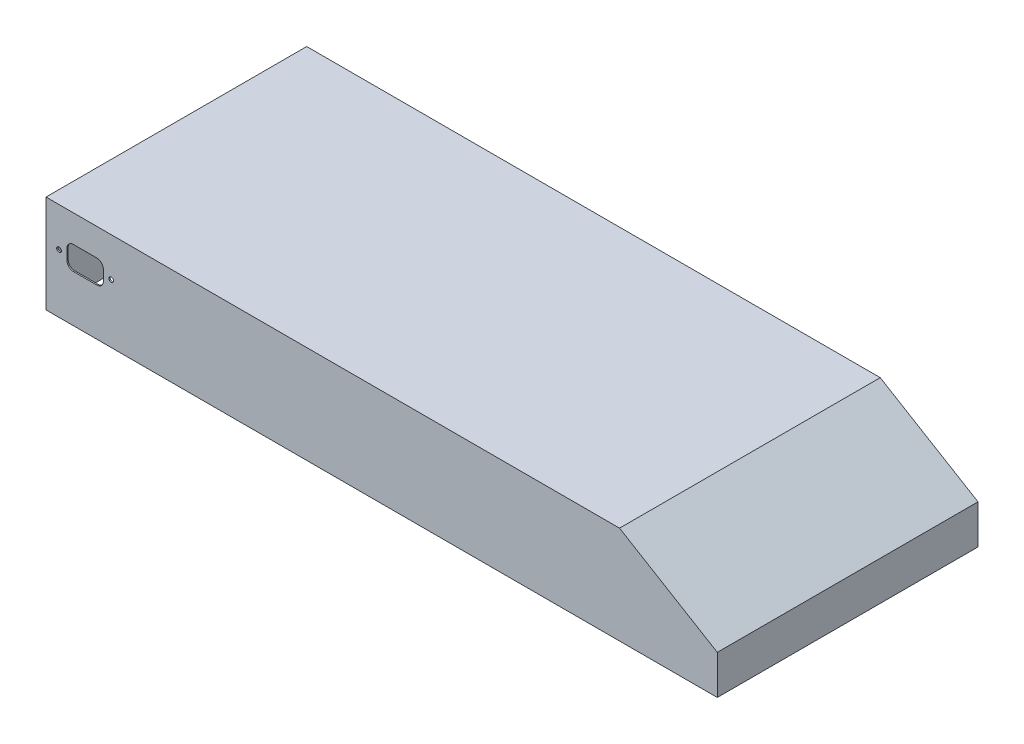
ISO-10303-21;
HEADER;
FILE_DESCRIPTION(('STEP AP214'),'2;1');
FILE_NAME('part.step','',(''),(''),'','','');
FILE_SCHEMA(('AUTOMOTIVE_DESIGN { 1 0 10303 214 1 1 1 1 }'));
ENDSEC;
DATA;
#1=APPLICATION_CONTEXT('core data for automotive mechanical design processes');
#2=APPLICATION_PROTOCOL_DEFINITION('international standard','automotive_design',2000,#1);
#3=PRODUCT_CONTEXT('',#1,'mechanical');
#4=PRODUCT('Part','Part','',(#3));
#5=PRODUCT_RELATED_PRODUCT_CATEGORY('part','',(#4));
#6=PRODUCT_DEFINITION_FORMATION('','',#4);
#7=PRODUCT_DEFINITION_CONTEXT('part definition',#1,'design');
#8=PRODUCT_DEFINITION('design','',#6,#7);
#9=PRODUCT_DEFINITION_SHAPE('','',#8);
#10=(LENGTH_UNIT() NAMED_UNIT(*) SI_UNIT(.MILLI.,.METRE.));
#11=(NAMED_UNIT(*) PLANE_ANGLE_UNIT() SI_UNIT($,.RADIAN.));
#12=(NAMED_UNIT(*) SI_UNIT($,.STERADIAN.) SOLID_ANGLE_UNIT());
#13=UNCERTAINTY_MEASURE_WITH_UNIT(LENGTH_MEASURE(1.E-05),#10,'distance_accuracy_value','');
#14=(GEOMETRIC_REPRESENTATION_CONTEXT(3) GLOBAL_UNCERTAINTY_ASSIGNED_CONTEXT((#13)) GLOBAL_UNIT_ASSIGNED_CONTEXT((#10,
#11,#12)) REPRESENTATION_CONTEXT('',''));
#15=CARTESIAN_POINT('',(0.,0.,0.));
#16=DIRECTION('',(0.,0.,1.));
#17=DIRECTION('',(1.,0.,0.));
#18=AXIS2_PLACEMENT_3D('',#15,#16,#17);
#19=CARTESIAN_POINT('',(0.,0.,100.));
#20=DIRECTION('',(0.,1.,0.));
#21=DIRECTION('',(0.,0.,1.));
#22=AXIS2_PLACEMENT_3D('',#19,#20,#21);
#23=PLANE('',#22);
#24=DIRECTION('',(1.,0.,0.));
#25=VECTOR('',#24,1.);
#26=CARTESIAN_POINT('',(0.,0.,-100.));
#27=LINE('',#26,#25);
#28=CARTESIAN_POINT('',(0.,0.,-100.));
#29=VERTEX_POINT('',#28);
#30=CARTESIAN_POINT('',(515.,0.,-100.));
#31=VERTEX_POINT('',#30);
#32=EDGE_CURVE('E256',#29,#31,#27,.T.);
#33=ORIENTED_EDGE('',*,*,#32,.T.);
#34=DIRECTION('',(0.,0.,-1.));
#35=VECTOR('',#34,1.);
#36=CARTESIAN_POINT('',(515.,0.,100.));
#37=LINE('',#36,#35);
#38=CARTESIAN_POINT('',(515.,0.,100.));
#39=VERTEX_POINT('',#38);
#40=EDGE_CURVE('E278',#39,#31,#37,.T.);
#41=ORIENTED_EDGE('',*,*,#40,.F.);
#42=DIRECTION('',(1.,0.,0.));
#43=VECTOR('',#42,1.);
#44=CARTESIAN_POINT('',(0.,0.,100.));
#45=LINE('',#44,#43);
#46=CARTESIAN_POINT('',(0.,0.,100.));
#47=VERTEX_POINT('',#46);
#48=EDGE_CURVE('E239',#47,#39,#45,.T.);
#49=ORIENTED_EDGE('',*,*,#48,.F.);
#50=DIRECTION('',(0.,0.,-1.));
#51=VECTOR('',#50,1.);
#52=CARTESIAN_POINT('',(0.,0.,100.));
#53=LINE('',#52,#51);
#54=EDGE_CURVE('E282',#47,#29,#53,.T.);
#55=ORIENTED_EDGE('',*,*,#54,.T.);
#56=EDGE_LOOP('',(#33,#41,#49,#55));
#57=FACE_BOUND('',#56,.T.);
#58=DIRECTION('',(1.,0.,0.));
#59=VECTOR('',#58,1.);
#60=CARTESIAN_POINT('',(0.,0.,-99.));
#61=LINE('',#60,#59);
#62=CARTESIAN_POINT('',(1.,0.,-99.));
#63=VERTEX_POINT('',#62);
#64=CARTESIAN_POINT('',(514.,0.,-99.));
#65=VERTEX_POINT('',#64);
#66=EDGE_CURVE('E192',#63,#65,#61,.T.);
#67=ORIENTED_EDGE('',*,*,#66,.F.);
#68=DIRECTION('',(0.,0.,-1.));
#69=VECTOR('',#68,1.);
#70=CARTESIAN_POINT('',(1.,0.,100.));
#71=LINE('',#70,#69);
#72=CARTESIAN_POINT('',(1.,0.,99.));
#73=VERTEX_POINT('',#72);
#74=EDGE_CURVE('E190',#73,#63,#71,.T.);
#75=ORIENTED_EDGE('',*,*,#74,.F.);
#76=DIRECTION('',(1.,0.,0.));
#77=VECTOR('',#76,1.);
#78=CARTESIAN_POINT('',(0.,0.,99.));
#79=LINE('',#78,#77);
#80=CARTESIAN_POINT('',(514.,0.,99.));
#81=VERTEX_POINT('',#80);
#82=EDGE_CURVE('E205',#73,#81,#79,.T.);
#83=ORIENTED_EDGE('',*,*,#82,.T.);
#84=DIRECTION('',(0.,0.,-1.));
#85=VECTOR('',#84,1.);
#86=CARTESIAN_POINT('',(514.,0.,100.));
#87=LINE('',#86,#85);
#88=EDGE_CURVE('E221',#81,#65,#87,.T.);
#89=ORIENTED_EDGE('',*,*,#88,.T.);
#90=EDGE_LOOP('',(#67,#75,#83,#89));
#91=FACE_BOUND('',#90,.T.);
#92=ADVANCED_FACE('F38',(#57,#91),#23,.F.);
#93=CARTESIAN_POINT('',(0.,75.,100.));
#94=DIRECTION('',(1.,0.,0.));
#95=DIRECTION('',(0.,1.,0.));
#96=AXIS2_PLACEMENT_3D('',#93,#94,#95);
#97=PLANE('',#96);
#98=DIRECTION('',(0.,-1.,0.));
#99=VECTOR('',#98,1.);
#100=CARTESIAN_POINT('',(0.,75.,-100.));
#101=LINE('',#100,#99);
#102=CARTESIAN_POINT('',(0.,75.,-100.));
#103=VERTEX_POINT('',#102);
#104=EDGE_CURVE('E227',#103,#29,#101,.T.);
#105=ORIENTED_EDGE('',*,*,#104,.T.);
#106=ORIENTED_EDGE('',*,*,#54,.F.);
#107=DIRECTION('',(0.,-1.,0.));
#108=VECTOR('',#107,1.);
#109=CARTESIAN_POINT('',(0.,75.,100.));
#110=LINE('',#109,#108);
#111=CARTESIAN_POINT('',(0.,75.,100.));
#112=VERTEX_POINT('',#111);
#113=EDGE_CURVE('E235',#112,#47,#110,.T.);
#114=ORIENTED_EDGE('',*,*,#113,.F.);
#115=DIRECTION('',(0.,0.,-1.));
#116=VECTOR('',#115,1.);
#117=CARTESIAN_POINT('',(0.,75.,100.));
#118=LINE('',#117,#116);
#119=EDGE_CURVE('E252',#112,#103,#118,.T.);
#120=ORIENTED_EDGE('',*,*,#119,.T.);
#121=EDGE_LOOP('',(#105,#106,#114,#120));
#122=FACE_BOUND('',#121,.T.);
#123=ADVANCED_FACE('F358',(#122),#97,.F.);
#124=CARTESIAN_POINT('',(515.,0.,100.));
#125=DIRECTION('',(-1.,0.,0.));
#126=DIRECTION('',(0.,0.,1.));
#127=AXIS2_PLACEMENT_3D('',#124,#125,#126);
#128=PLANE('',#127);
#129=DIRECTION('',(0.,1.,0.));
#130=VECTOR('',#129,1.);
#131=CARTESIAN_POINT('',(515.,0.,-100.));
#132=LINE('',#131,#130);
#133=CARTESIAN_POINT('',(515.,30.,-100.));
#134=VERTEX_POINT('',#133);
#135=EDGE_CURVE('E259',#31,#134,#132,.T.);
#136=ORIENTED_EDGE('',*,*,#135,.T.);
#137=DIRECTION('',(0.,0.,-1.));
#138=VECTOR('',#137,1.);
#139=CARTESIAN_POINT('',(515.,30.,100.));
#140=LINE('',#139,#138);
#141=CARTESIAN_POINT('',(515.,30.,100.));
#142=VERTEX_POINT('',#141);
#143=EDGE_CURVE('E274',#142,#134,#140,.T.);
#144=ORIENTED_EDGE('',*,*,#143,.F.);
#145=DIRECTION('',(0.,1.,0.));
#146=VECTOR('',#145,1.);
#147=CARTESIAN_POINT('',(515.,0.,100.));
#148=LINE('',#147,#146);
#149=EDGE_CURVE('E243',#39,#142,#148,.T.);
#150=ORIENTED_EDGE('',*,*,#149,.F.);
#151=ORIENTED_EDGE('',*,*,#40,.T.);
#152=EDGE_LOOP('',(#136,#144,#150,#151));
#153=FACE_BOUND('',#152,.T.);
#154=ADVANCED_FACE('F364',(#153),#128,.F.);
#155=CARTESIAN_POINT('',(515.,30.,100.));
#156=DIRECTION('',(-0.514495755427527,-0.857492925712544,0.));
#157=DIRECTION('',(0.857492925712544,-0.514495755427527,0.));
#158=AXIS2_PLACEMENT_3D('',#155,#156,#157);
#159=PLANE('',#158);
#160=DIRECTION('',(-0.857492925712544,0.514495755427527,0.));
#161=VECTOR('',#160,1.);
#162=CARTESIAN_POINT('',(515.,30.,-100.));
#163=LINE('',#162,#161);
#164=CARTESIAN_POINT('',(440.,75.0000000000001,-100.));
#165=VERTEX_POINT('',#164);
#166=EDGE_CURVE('E262',#134,#165,#163,.T.);
#167=ORIENTED_EDGE('',*,*,#166,.T.);
#168=DIRECTION('',(0.,0.,-1.));
#169=VECTOR('',#168,1.);
#170=CARTESIAN_POINT('',(440.,75.0000000000001,100.));
#171=LINE('',#170,#169);
#172=CARTESIAN_POINT('',(440.,75.0000000000001,100.));
#173=VERTEX_POINT('',#172);
#174=EDGE_CURVE('E270',#173,#165,#171,.T.);
#175=ORIENTED_EDGE('',*,*,#174,.F.);
#176=DIRECTION('',(-0.857492925712544,0.514495755427527,0.));
#177=VECTOR('',#176,1.);
#178=CARTESIAN_POINT('',(515.,30.,100.));
#179=LINE('',#178,#177);
#180=EDGE_CURVE('E246',#142,#173,#179,.T.);
#181=ORIENTED_EDGE('',*,*,#180,.F.);
#182=ORIENTED_EDGE('',*,*,#143,.T.);
#183=EDGE_LOOP('',(#167,#175,#181,#182));
#184=FACE_BOUND('',#183,.T.);
#185=ADVANCED_FACE('F437',(#184),#159,.F.);
#186=CARTESIAN_POINT('',(440.,75.0000000000001,100.));
#187=DIRECTION('',(0.,-1.,0.));
#188=DIRECTION('',(1.,0.,0.));
#189=AXIS2_PLACEMENT_3D('',#186,#187,#188);
#190=PLANE('',#189);
#191=DIRECTION('',(-1.,0.,0.));
#192=VECTOR('',#191,1.);
#193=CARTESIAN_POINT('',(440.,75.0000000000001,-100.));
#194=LINE('',#193,#192);
#195=EDGE_CURVE('E240',#165,#103,#194,.T.);
#196=ORIENTED_EDGE('',*,*,#195,.T.);
#197=ORIENTED_EDGE('',*,*,#119,.F.);
#198=DIRECTION('',(-1.,0.,0.));
#199=VECTOR('',#198,1.);
#200=CARTESIAN_POINT('',(440.,75.0000000000001,100.));
#201=LINE('',#200,#199);
#202=EDGE_CURVE('E249',#173,#112,#201,.T.);
#203=ORIENTED_EDGE('',*,*,#202,.F.);
#204=ORIENTED_EDGE('',*,*,#174,.T.);
#205=EDGE_LOOP('',(#196,#197,#203,#204));
#206=FACE_BOUND('',#205,.T.);
#207=ADVANCED_FACE('F421',(#206),#190,.F.);
#208=CARTESIAN_POINT('',(0.,0.,100.));
#209=DIRECTION('',(0.,0.,1.));
#210=DIRECTION('',(1.,0.,0.));
#211=AXIS2_PLACEMENT_3D('',#208,#209,#210);
#212=PLANE('',#211);
#213=CARTESIAN_POINT('',(10.,45.0465251622132,100.));
#214=DIRECTION('',(0.,0.,1.));
#215=DIRECTION('',(1.,0.,0.));
#216=AXIS2_PLACEMENT_3D('',#213,#214,#215);
#217=CIRCLE('',#216,1.79999999999999);
#218=CARTESIAN_POINT('',(11.8,45.0465251622132,100.));
#219=VERTEX_POINT('',#218);
#220=EDGE_CURVE('E600',#219,#219,#217,.T.);
#221=ORIENTED_EDGE('',*,*,#220,.F.);
#222=EDGE_LOOP('',(#221));
#223=FACE_BOUND('',#222,.T.);
#224=CARTESIAN_POINT('',(50.,45.0465251622132,100.));
#225=DIRECTION('',(0.,0.,1.));
#226=DIRECTION('',(1.,0.,0.));
#227=AXIS2_PLACEMENT_3D('',#224,#225,#226);
#228=CIRCLE('',#227,1.79999999999999);
#229=CARTESIAN_POINT('',(51.8,45.0465251622132,100.));
#230=VERTEX_POINT('',#229);
#231=EDGE_CURVE('E605',#230,#230,#228,.T.);
#232=ORIENTED_EDGE('',*,*,#231,.F.);
#233=EDGE_LOOP('',(#232));
#234=FACE_BOUND('',#233,.T.);
#235=DIRECTION('',(0.,-1.,0.));
#236=VECTOR('',#235,1.);
#237=CARTESIAN_POINT('',(16.,54.0000000000001,100.));
#238=LINE('',#237,#236);
#239=CARTESIAN_POINT('',(16.,49.0000000000001,100.));
#240=VERTEX_POINT('',#239);
#241=CARTESIAN_POINT('',(16.,41.,100.));
#242=VERTEX_POINT('',#241);
#243=EDGE_CURVE('E404',#240,#242,#238,.T.);
#244=ORIENTED_EDGE('',*,*,#243,.F.);
#245=CARTESIAN_POINT('',(21.,49.0000000000001,100.));
#246=DIRECTION('',(0.,0.,1.));
#247=DIRECTION('',(1.,0.,0.));
#248=AXIS2_PLACEMENT_3D('',#245,#246,#247);
#249=CIRCLE('',#248,5.);
#250=CARTESIAN_POINT('',(21.,54.0000000000001,100.));
#251=VERTEX_POINT('',#250);
#252=EDGE_CURVE('E61',#240,#251,#249,.F.);
#253=ORIENTED_EDGE('',*,*,#252,.T.);
#254=DIRECTION('',(-1.,0.,0.));
#255=VECTOR('',#254,1.);
#256=CARTESIAN_POINT('',(16.,54.0000000000001,100.));
#257=LINE('',#256,#255);
#258=CARTESIAN_POINT('',(39.,54.0000000000001,100.));
#259=VERTEX_POINT('',#258);
#260=EDGE_CURVE('E393',#259,#251,#257,.T.);
#261=ORIENTED_EDGE('',*,*,#260,.F.);
#262=CARTESIAN_POINT('',(39.,49.0000000000001,100.));
#263=DIRECTION('',(0.,0.,1.));
#264=DIRECTION('',(1.,0.,0.));
#265=AXIS2_PLACEMENT_3D('',#262,#263,#264);
#266=CIRCLE('',#265,5.);
#267=CARTESIAN_POINT('',(44.,49.0000000000001,100.));
#268=VERTEX_POINT('',#267);
#269=EDGE_CURVE('E319',#259,#268,#266,.F.);
#270=ORIENTED_EDGE('',*,*,#269,.T.);
#271=DIRECTION('',(0.,1.,0.));
#272=VECTOR('',#271,1.);
#273=CARTESIAN_POINT('',(44.,54.0000000000001,100.));
#274=LINE('',#273,#272);
#275=CARTESIAN_POINT('',(44.,41.,100.));
#276=VERTEX_POINT('',#275);
#277=EDGE_CURVE('E399',#276,#268,#274,.T.);
#278=ORIENTED_EDGE('',*,*,#277,.F.);
#279=CARTESIAN_POINT('',(39.,41.,100.));
#280=DIRECTION('',(0.,0.,1.));
#281=DIRECTION('',(1.,0.,0.));
#282=AXIS2_PLACEMENT_3D('',#279,#280,#281);
#283=CIRCLE('',#282,5.);
#284=CARTESIAN_POINT('',(39.,36.,100.));
#285=VERTEX_POINT('',#284);
#286=EDGE_CURVE('E313',#276,#285,#283,.F.);
#287=ORIENTED_EDGE('',*,*,#286,.T.);
#288=DIRECTION('',(1.,0.,0.));
#289=VECTOR('',#288,1.);
#290=CARTESIAN_POINT('',(16.,36.,100.));
#291=LINE('',#290,#289);
#292=CARTESIAN_POINT('',(21.,36.,100.));
#293=VERTEX_POINT('',#292);
#294=EDGE_CURVE('E407',#293,#285,#291,.T.);
#295=ORIENTED_EDGE('',*,*,#294,.F.);
#296=CARTESIAN_POINT('',(21.,41.,100.));
#297=DIRECTION('',(0.,0.,1.));
#298=DIRECTION('',(1.,0.,0.));
#299=AXIS2_PLACEMENT_3D('',#296,#297,#298);
#300=CIRCLE('',#299,5.);
#301=EDGE_CURVE('E47',#293,#242,#300,.F.);
#302=ORIENTED_EDGE('',*,*,#301,.T.);
#303=EDGE_LOOP('',(#244,#253,#261,#270,#278,#287,#295,#302));
#304=FACE_BOUND('',#303,.T.);
#305=ORIENTED_EDGE('',*,*,#113,.T.);
#306=ORIENTED_EDGE('',*,*,#48,.T.);
#307=ORIENTED_EDGE('',*,*,#149,.T.);
#308=ORIENTED_EDGE('',*,*,#180,.T.);
#309=ORIENTED_EDGE('',*,*,#202,.T.);
#310=EDGE_LOOP('',(#305,#306,#307,#308,#309));
#311=FACE_BOUND('',#310,.T.);
#312=ADVANCED_FACE('F416',(#223,#234,#304,#311),#212,.T.);
#313=CARTESIAN_POINT('',(0.,0.,-100.));
#314=DIRECTION('',(0.,0.,1.));
#315=DIRECTION('',(1.,0.,0.));
#316=AXIS2_PLACEMENT_3D('',#313,#314,#315);
#317=PLANE('',#316);
#318=ORIENTED_EDGE('',*,*,#104,.F.);
#319=ORIENTED_EDGE('',*,*,#195,.F.);
#320=ORIENTED_EDGE('',*,*,#166,.F.);
#321=ORIENTED_EDGE('',*,*,#135,.F.);
#322=ORIENTED_EDGE('',*,*,#32,.F.);
#323=EDGE_LOOP('',(#318,#319,#320,#321,#322));
#324=FACE_BOUND('',#323,.T.);
#325=ADVANCED_FACE('F420',(#324),#317,.F.);
#326=CARTESIAN_POINT('',(1.,75.,100.));
#327=DIRECTION('',(1.,0.,0.));
#328=DIRECTION('',(0.,1.,0.));
#329=AXIS2_PLACEMENT_3D('',#326,#327,#328);
#330=PLANE('',#329);
#331=DIRECTION('',(0.,-1.,0.));
#332=VECTOR('',#331,1.);
#333=CARTESIAN_POINT('',(1.,75.,-99.));
#334=LINE('',#333,#332);
#335=CARTESIAN_POINT('',(1.,74.,-99.));
#336=VERTEX_POINT('',#335);
#337=EDGE_CURVE('E168',#336,#63,#334,.T.);
#338=ORIENTED_EDGE('',*,*,#337,.F.);
#339=DIRECTION('',(0.,0.,-1.));
#340=VECTOR('',#339,1.);
#341=CARTESIAN_POINT('',(1.,74.,100.));
#342=LINE('',#341,#340);
#343=CARTESIAN_POINT('',(1.,74.,99.));
#344=VERTEX_POINT('',#343);
#345=EDGE_CURVE('E179',#344,#336,#342,.T.);
#346=ORIENTED_EDGE('',*,*,#345,.F.);
#347=DIRECTION('',(0.,-1.,0.));
#348=VECTOR('',#347,1.);
#349=CARTESIAN_POINT('',(1.,75.,99.));
#350=LINE('',#349,#348);
#351=EDGE_CURVE('E176',#344,#73,#350,.T.);
#352=ORIENTED_EDGE('',*,*,#351,.T.);
#353=ORIENTED_EDGE('',*,*,#74,.T.);
#354=EDGE_LOOP('',(#338,#346,#352,#353));
#355=FACE_BOUND('',#354,.T.);
#356=ADVANCED_FACE('F188',(#355),#330,.T.);
#357=CARTESIAN_POINT('',(514.,0.,100.));
#358=DIRECTION('',(-1.,0.,0.));
#359=DIRECTION('',(0.,0.,1.));
#360=AXIS2_PLACEMENT_3D('',#357,#358,#359);
#361=PLANE('',#360);
#362=DIRECTION('',(0.,1.,0.));
#363=VECTOR('',#362,1.);
#364=CARTESIAN_POINT('',(514.,0.,-99.));
#365=LINE('',#364,#363);
#366=CARTESIAN_POINT('',(514.,29.433809621031,-99.));
#367=VERTEX_POINT('',#366);
#368=EDGE_CURVE('E197',#65,#367,#365,.T.);
#369=ORIENTED_EDGE('',*,*,#368,.F.);
#370=ORIENTED_EDGE('',*,*,#88,.F.);
#371=DIRECTION('',(0.,1.,0.));
#372=VECTOR('',#371,1.);
#373=CARTESIAN_POINT('',(514.,0.,99.));
#374=LINE('',#373,#372);
#375=CARTESIAN_POINT('',(514.,29.433809621031,99.));
#376=VERTEX_POINT('',#375);
#377=EDGE_CURVE('E217',#81,#376,#374,.T.);
#378=ORIENTED_EDGE('',*,*,#377,.T.);
#379=DIRECTION('',(0.,0.,-1.));
#380=VECTOR('',#379,1.);
#381=CARTESIAN_POINT('',(514.,29.433809621031,100.));
#382=LINE('',#381,#380);
#383=EDGE_CURVE('E212',#376,#367,#382,.T.);
#384=ORIENTED_EDGE('',*,*,#383,.T.);
#385=EDGE_LOOP('',(#369,#370,#378,#384));
#386=FACE_BOUND('',#385,.T.);
#387=ADVANCED_FACE('F447',(#386),#361,.T.);
#388=CARTESIAN_POINT('',(514.485504244573,29.1425070742875,100.));
#389=DIRECTION('',(-0.514495755427527,-0.857492925712544,0.));
#390=DIRECTION('',(0.857492925712544,-0.514495755427527,0.));
#391=AXIS2_PLACEMENT_3D('',#388,#389,#390);
#392=PLANE('',#391);
#393=DIRECTION('',(-0.857492925712544,0.514495755427527,0.));
#394=VECTOR('',#393,1.);
#395=CARTESIAN_POINT('',(514.485504244573,29.1425070742875,-99.));
#396=LINE('',#395,#394);
#397=CARTESIAN_POINT('',(439.723016035052,74.0000000000001,-99.));
#398=VERTEX_POINT('',#397);
#399=EDGE_CURVE('E171',#367,#398,#396,.T.);
#400=ORIENTED_EDGE('',*,*,#399,.F.);
#401=ORIENTED_EDGE('',*,*,#383,.F.);
#402=DIRECTION('',(-0.857492925712544,0.514495755427527,0.));
#403=VECTOR('',#402,1.);
#404=CARTESIAN_POINT('',(514.485504244573,29.1425070742875,99.));
#405=LINE('',#404,#403);
#406=CARTESIAN_POINT('',(439.723016035052,74.0000000000001,99.));
#407=VERTEX_POINT('',#406);
#408=EDGE_CURVE('E209',#376,#407,#405,.T.);
#409=ORIENTED_EDGE('',*,*,#408,.T.);
#410=DIRECTION('',(0.,0.,-1.));
#411=VECTOR('',#410,1.);
#412=CARTESIAN_POINT('',(439.723016035052,74.0000000000001,100.));
#413=LINE('',#412,#411);
#414=EDGE_CURVE('E186',#407,#398,#413,.T.);
#415=ORIENTED_EDGE('',*,*,#414,.T.);
#416=EDGE_LOOP('',(#400,#401,#409,#415));
#417=FACE_BOUND('',#416,.T.);
#418=ADVANCED_FACE('F503',(#417),#392,.T.);
#419=CARTESIAN_POINT('',(440.,74.0000000000001,100.));
#420=DIRECTION('',(0.,-1.,0.));
#421=DIRECTION('',(1.,0.,0.));
#422=AXIS2_PLACEMENT_3D('',#419,#420,#421);
#423=PLANE('',#422);
#424=DIRECTION('',(-1.,0.,0.));
#425=VECTOR('',#424,1.);
#426=CARTESIAN_POINT('',(440.,74.0000000000001,-99.));
#427=LINE('',#426,#425);
#428=EDGE_CURVE('E164',#398,#336,#427,.T.);
#429=ORIENTED_EDGE('',*,*,#428,.F.);
#430=ORIENTED_EDGE('',*,*,#414,.F.);
#431=DIRECTION('',(-1.,0.,0.));
#432=VECTOR('',#431,1.);
#433=CARTESIAN_POINT('',(440.,74.0000000000001,99.));
#434=LINE('',#433,#432);
#435=EDGE_CURVE('E182',#407,#344,#434,.T.);
#436=ORIENTED_EDGE('',*,*,#435,.T.);
#437=ORIENTED_EDGE('',*,*,#345,.T.);
#438=EDGE_LOOP('',(#429,#430,#436,#437));
#439=FACE_BOUND('',#438,.T.);
#440=ADVANCED_FACE('F180',(#439),#423,.T.);
#441=CARTESIAN_POINT('',(0.,0.,99.));
#442=DIRECTION('',(0.,0.,1.));
#443=DIRECTION('',(1.,0.,0.));
#444=AXIS2_PLACEMENT_3D('',#441,#442,#443);
#445=PLANE('',#444);
#446=CARTESIAN_POINT('',(10.,45.0465251622132,99.));
#447=DIRECTION('',(0.,0.,1.));
#448=DIRECTION('',(1.,0.,0.));
#449=AXIS2_PLACEMENT_3D('',#446,#447,#448);
#450=CIRCLE('',#449,1.79999999999998);
#451=CARTESIAN_POINT('',(11.8,45.0465251622132,99.));
#452=VERTEX_POINT('',#451);
#453=EDGE_CURVE('E603',#452,#452,#450,.T.);
#454=ORIENTED_EDGE('',*,*,#453,.T.);
#455=EDGE_LOOP('',(#454));
#456=FACE_BOUND('',#455,.T.);
#457=CARTESIAN_POINT('',(50.,45.0465251622132,99.));
#458=DIRECTION('',(0.,0.,1.));
#459=DIRECTION('',(1.,0.,0.));
#460=AXIS2_PLACEMENT_3D('',#457,#458,#459);
#461=CIRCLE('',#460,1.79999999999998);
#462=CARTESIAN_POINT('',(51.8,45.0465251622132,99.));
#463=VERTEX_POINT('',#462);
#464=EDGE_CURVE('E401',#463,#463,#461,.T.);
#465=ORIENTED_EDGE('',*,*,#464,.T.);
#466=EDGE_LOOP('',(#465));
#467=FACE_BOUND('',#466,.T.);
#468=DIRECTION('',(1.,0.,0.));
#469=VECTOR('',#468,1.);
#470=CARTESIAN_POINT('',(16.,54.0000000000001,99.));
#471=LINE('',#470,#469);
#472=CARTESIAN_POINT('',(21.,54.0000000000001,99.));
#473=VERTEX_POINT('',#472);
#474=CARTESIAN_POINT('',(39.,54.0000000000001,99.));
#475=VERTEX_POINT('',#474);
#476=EDGE_CURVE('E339',#473,#475,#471,.T.);
#477=ORIENTED_EDGE('',*,*,#476,.F.);
#478=CARTESIAN_POINT('',(21.,49.0000000000001,99.));
#479=DIRECTION('',(0.,0.,1.));
#480=DIRECTION('',(1.,0.,0.));
#481=AXIS2_PLACEMENT_3D('',#478,#479,#480);
#482=CIRCLE('',#481,5.);
#483=CARTESIAN_POINT('',(16.,49.0000000000001,99.));
#484=VERTEX_POINT('',#483);
#485=EDGE_CURVE('E327',#473,#484,#482,.T.);
#486=ORIENTED_EDGE('',*,*,#485,.T.);
#487=DIRECTION('',(0.,1.,0.));
#488=VECTOR('',#487,1.);
#489=CARTESIAN_POINT('',(16.,54.0000000000001,99.));
#490=LINE('',#489,#488);
#491=CARTESIAN_POINT('',(16.,41.,99.));
#492=VERTEX_POINT('',#491);
#493=EDGE_CURVE('E200',#492,#484,#490,.T.);
#494=ORIENTED_EDGE('',*,*,#493,.F.);
#495=CARTESIAN_POINT('',(21.,41.,99.));
#496=DIRECTION('',(0.,0.,1.));
#497=DIRECTION('',(1.,0.,0.));
#498=AXIS2_PLACEMENT_3D('',#495,#496,#497);
#499=CIRCLE('',#498,5.);
#500=CARTESIAN_POINT('',(21.,36.,99.));
#501=VERTEX_POINT('',#500);
#502=EDGE_CURVE('E11',#492,#501,#499,.T.);
#503=ORIENTED_EDGE('',*,*,#502,.T.);
#504=DIRECTION('',(-1.,0.,0.));
#505=VECTOR('',#504,1.);
#506=CARTESIAN_POINT('',(16.,36.,99.));
#507=LINE('',#506,#505);
#508=CARTESIAN_POINT('',(39.,36.,99.));
#509=VERTEX_POINT('',#508);
#510=EDGE_CURVE('E193',#509,#501,#507,.T.);
#511=ORIENTED_EDGE('',*,*,#510,.F.);
#512=CARTESIAN_POINT('',(39.,41.,99.));
#513=DIRECTION('',(0.,0.,1.));
#514=DIRECTION('',(1.,0.,0.));
#515=AXIS2_PLACEMENT_3D('',#512,#513,#514);
#516=CIRCLE('',#515,5.);
#517=CARTESIAN_POINT('',(44.,41.,99.));
#518=VERTEX_POINT('',#517);
#519=EDGE_CURVE('E316',#509,#518,#516,.T.);
#520=ORIENTED_EDGE('',*,*,#519,.T.);
#521=DIRECTION('',(0.,-1.,0.));
#522=VECTOR('',#521,1.);
#523=CARTESIAN_POINT('',(44.,54.0000000000001,99.));
#524=LINE('',#523,#522);
#525=CARTESIAN_POINT('',(44.,49.0000000000001,99.));
#526=VERTEX_POINT('',#525);
#527=EDGE_CURVE('E386',#526,#518,#524,.T.);
#528=ORIENTED_EDGE('',*,*,#527,.F.);
#529=CARTESIAN_POINT('',(39.,49.0000000000001,99.));
#530=DIRECTION('',(0.,0.,1.));
#531=DIRECTION('',(1.,0.,0.));
#532=AXIS2_PLACEMENT_3D('',#529,#530,#531);
#533=CIRCLE('',#532,5.);
#534=EDGE_CURVE('E322',#526,#475,#533,.T.);
#535=ORIENTED_EDGE('',*,*,#534,.T.);
#536=EDGE_LOOP('',(#477,#486,#494,#503,#511,#520,#528,#535));
#537=FACE_BOUND('',#536,.T.);
#538=ORIENTED_EDGE('',*,*,#351,.F.);
#539=ORIENTED_EDGE('',*,*,#435,.F.);
#540=ORIENTED_EDGE('',*,*,#408,.F.);
#541=ORIENTED_EDGE('',*,*,#377,.F.);
#542=ORIENTED_EDGE('',*,*,#82,.F.);
#543=EDGE_LOOP('',(#538,#539,#540,#541,#542));
#544=FACE_BOUND('',#543,.T.);
#545=ADVANCED_FACE('F335',(#456,#467,#537,#544),#445,.F.);
#546=CARTESIAN_POINT('',(0.,0.,-99.));
#547=DIRECTION('',(0.,0.,1.));
#548=DIRECTION('',(1.,0.,0.));
#549=AXIS2_PLACEMENT_3D('',#546,#547,#548);
#550=PLANE('',#549);
#551=ORIENTED_EDGE('',*,*,#337,.T.);
#552=ORIENTED_EDGE('',*,*,#66,.T.);
#553=ORIENTED_EDGE('',*,*,#368,.T.);
#554=ORIENTED_EDGE('',*,*,#399,.T.);
#555=ORIENTED_EDGE('',*,*,#428,.T.);
#556=EDGE_LOOP('',(#551,#552,#553,#554,#555));
#557=FACE_BOUND('',#556,.T.);
#558=ADVANCED_FACE('F166',(#557),#550,.T.);
#559=CARTESIAN_POINT('',(16.,54.0000000000001,65.7133660458135));
#560=DIRECTION('',(-1.,0.,0.));
#561=DIRECTION('',(0.,0.,1.));
#562=AXIS2_PLACEMENT_3D('',#559,#560,#561);
#563=PLANE('',#562);
#564=ORIENTED_EDGE('',*,*,#493,.T.);
#565=DIRECTION('',(0.,0.,1.));
#566=VECTOR('',#565,1.);
#567=CARTESIAN_POINT('',(16.,49.0000000000001,100.));
#568=LINE('',#567,#566);
#569=EDGE_CURVE('E310',#484,#240,#568,.T.);
#570=ORIENTED_EDGE('',*,*,#569,.T.);
#571=ORIENTED_EDGE('',*,*,#243,.T.);
#572=DIRECTION('',(0.,0.,1.));
#573=VECTOR('',#572,1.);
#574=CARTESIAN_POINT('',(16.,41.,99.));
#575=LINE('',#574,#573);
#576=EDGE_CURVE('E307',#242,#492,#575,.F.);
#577=ORIENTED_EDGE('',*,*,#576,.T.);
#578=EDGE_LOOP('',(#564,#570,#571,#577));
#579=FACE_BOUND('',#578,.T.);
#580=ADVANCED_FACE('F341',(#579),#563,.F.);
#581=CARTESIAN_POINT('',(16.,54.0000000000001,65.7133660458135));
#582=DIRECTION('',(0.,1.,0.));
#583=DIRECTION('',(0.,0.,1.));
#584=AXIS2_PLACEMENT_3D('',#581,#582,#583);
#585=PLANE('',#584);
#586=ORIENTED_EDGE('',*,*,#476,.T.);
#587=DIRECTION('',(0.,0.,1.));
#588=VECTOR('',#587,1.);
#589=CARTESIAN_POINT('',(39.,54.0000000000001,100.));
#590=LINE('',#589,#588);
#591=EDGE_CURVE('E303',#475,#259,#590,.T.);
#592=ORIENTED_EDGE('',*,*,#591,.T.);
#593=ORIENTED_EDGE('',*,*,#260,.T.);
#594=DIRECTION('',(0.,0.,1.));
#595=VECTOR('',#594,1.);
#596=CARTESIAN_POINT('',(21.,54.0000000000001,99.));
#597=LINE('',#596,#595);
#598=EDGE_CURVE('E300',#251,#473,#597,.F.);
#599=ORIENTED_EDGE('',*,*,#598,.T.);
#600=EDGE_LOOP('',(#586,#592,#593,#599));
#601=FACE_BOUND('',#600,.T.);
#602=ADVANCED_FACE('F414',(#601),#585,.F.);
#603=CARTESIAN_POINT('',(44.,54.0000000000001,65.7133660458135));
#604=DIRECTION('',(1.,0.,0.));
#605=DIRECTION('',(0.,1.,0.));
#606=AXIS2_PLACEMENT_3D('',#603,#604,#605);
#607=PLANE('',#606);
#608=ORIENTED_EDGE('',*,*,#527,.T.);
#609=DIRECTION('',(0.,0.,1.));
#610=VECTOR('',#609,1.);
#611=CARTESIAN_POINT('',(44.,41.,100.));
#612=LINE('',#611,#610);
#613=EDGE_CURVE('E289',#518,#276,#612,.T.);
#614=ORIENTED_EDGE('',*,*,#613,.T.);
#615=ORIENTED_EDGE('',*,*,#277,.T.);
#616=DIRECTION('',(0.,0.,1.));
#617=VECTOR('',#616,1.);
#618=CARTESIAN_POINT('',(44.,49.0000000000001,99.));
#619=LINE('',#618,#617);
#620=EDGE_CURVE('E286',#268,#526,#619,.F.);
#621=ORIENTED_EDGE('',*,*,#620,.T.);
#622=EDGE_LOOP('',(#608,#614,#615,#621));
#623=FACE_BOUND('',#622,.T.);
#624=ADVANCED_FACE('F377',(#623),#607,.F.);
#625=CARTESIAN_POINT('',(16.,36.,65.7133660458135));
#626=DIRECTION('',(0.,-1.,0.));
#627=DIRECTION('',(0.,0.,-1.));
#628=AXIS2_PLACEMENT_3D('',#625,#626,#627);
#629=PLANE('',#628);
#630=ORIENTED_EDGE('',*,*,#294,.T.);
#631=DIRECTION('',(0.,0.,1.));
#632=VECTOR('',#631,1.);
#633=CARTESIAN_POINT('',(39.,36.,99.));
#634=LINE('',#633,#632);
#635=EDGE_CURVE('E297',#285,#509,#634,.F.);
#636=ORIENTED_EDGE('',*,*,#635,.T.);
#637=ORIENTED_EDGE('',*,*,#510,.T.);
#638=DIRECTION('',(0.,0.,1.));
#639=VECTOR('',#638,1.);
#640=CARTESIAN_POINT('',(21.,36.,100.));
#641=LINE('',#640,#639);
#642=EDGE_CURVE('E293',#501,#293,#641,.T.);
#643=ORIENTED_EDGE('',*,*,#642,.T.);
#644=EDGE_LOOP('',(#630,#636,#637,#643));
#645=FACE_BOUND('',#644,.T.);
#646=ADVANCED_FACE('F372',(#645),#629,.F.);
#647=CARTESIAN_POINT('',(39.,41.,65.7133660458135));
#648=DIRECTION('',(0.,0.,-1.));
#649=DIRECTION('',(-1.,0.,0.));
#650=AXIS2_PLACEMENT_3D('',#647,#648,#649);
#651=CYLINDRICAL_SURFACE('',#650,5.);
#652=ORIENTED_EDGE('',*,*,#519,.F.);
#653=ORIENTED_EDGE('',*,*,#635,.F.);
#654=ORIENTED_EDGE('',*,*,#286,.F.);
#655=ORIENTED_EDGE('',*,*,#613,.F.);
#656=EDGE_LOOP('',(#652,#653,#654,#655));
#657=FACE_BOUND('',#656,.T.);
#658=ADVANCED_FACE('F354',(#657),#651,.F.);
#659=CARTESIAN_POINT('',(39.,49.0000000000001,65.7133660458135));
#660=DIRECTION('',(0.,0.,-1.));
#661=DIRECTION('',(-1.,0.,0.));
#662=AXIS2_PLACEMENT_3D('',#659,#660,#661);
#663=CYLINDRICAL_SURFACE('',#662,5.);
#664=ORIENTED_EDGE('',*,*,#534,.F.);
#665=ORIENTED_EDGE('',*,*,#620,.F.);
#666=ORIENTED_EDGE('',*,*,#269,.F.);
#667=ORIENTED_EDGE('',*,*,#591,.F.);
#668=EDGE_LOOP('',(#664,#665,#666,#667));
#669=FACE_BOUND('',#668,.T.);
#670=ADVANCED_FACE('F347',(#669),#663,.F.);
#671=CARTESIAN_POINT('',(21.,49.0000000000001,65.7133660458135));
#672=DIRECTION('',(0.,0.,-1.));
#673=DIRECTION('',(-1.,0.,0.));
#674=AXIS2_PLACEMENT_3D('',#671,#672,#673);
#675=CYLINDRICAL_SURFACE('',#674,5.);
#676=ORIENTED_EDGE('',*,*,#485,.F.);
#677=ORIENTED_EDGE('',*,*,#598,.F.);
#678=ORIENTED_EDGE('',*,*,#252,.F.);
#679=ORIENTED_EDGE('',*,*,#569,.F.);
#680=EDGE_LOOP('',(#676,#677,#678,#679));
#681=FACE_BOUND('',#680,.T.);
#682=ADVANCED_FACE('F345',(#681),#675,.F.);
#683=CARTESIAN_POINT('',(21.,41.,65.7133660458135));
#684=DIRECTION('',(0.,0.,-1.));
#685=DIRECTION('',(-1.,0.,0.));
#686=AXIS2_PLACEMENT_3D('',#683,#684,#685);
#687=CYLINDRICAL_SURFACE('',#686,5.);
#688=ORIENTED_EDGE('',*,*,#502,.F.);
#689=ORIENTED_EDGE('',*,*,#576,.F.);
#690=ORIENTED_EDGE('',*,*,#301,.F.);
#691=ORIENTED_EDGE('',*,*,#642,.F.);
#692=EDGE_LOOP('',(#688,#689,#690,#691));
#693=FACE_BOUND('',#692,.T.);
#694=ADVANCED_FACE('F40',(#693),#687,.F.);
#695=CARTESIAN_POINT('',(50.,45.0465251622132,100.));
#696=DIRECTION('',(0.,0.,1.));
#697=DIRECTION('',(1.,0.,0.));
#698=AXIS2_PLACEMENT_3D('',#695,#696,#697);
#699=CYLINDRICAL_SURFACE('',#698,1.79999999999998);
#700=ORIENTED_EDGE('',*,*,#231,.T.);
#701=EDGE_LOOP('',(#700));
#702=FACE_BOUND('',#701,.T.);
#703=ORIENTED_EDGE('',*,*,#464,.F.);
#704=EDGE_LOOP('',(#703));
#705=FACE_BOUND('',#704,.T.);
#706=ADVANCED_FACE('F352',(#702,#705),#699,.F.);
#707=CARTESIAN_POINT('',(10.,45.0465251622132,100.));
#708=DIRECTION('',(0.,0.,1.));
#709=DIRECTION('',(1.,0.,0.));
#710=AXIS2_PLACEMENT_3D('',#707,#708,#709);
#711=CYLINDRICAL_SURFACE('',#710,1.79999999999998);
#712=ORIENTED_EDGE('',*,*,#220,.T.);
#713=EDGE_LOOP('',(#712));
#714=FACE_BOUND('',#713,.T.);
#715=ORIENTED_EDGE('',*,*,#453,.F.);
#716=EDGE_LOOP('',(#715));
#717=FACE_BOUND('',#716,.T.);
#718=ADVANCED_FACE('F583',(#714,#717),#711,.F.);
#719=CLOSED_SHELL('',(#92,#123,#154,#185,#207,#312,#325,#356,#387,#418,#440,#545,#558,#580,#602,
#624,#646,#658,#670,#682,#694,#706,#718));
#720=MANIFOLD_SOLID_BREP('B2',#719);
#721=ADVANCED_BREP_SHAPE_REPRESENTATION('',(#18,#720),#14);
#722=SHAPE_DEFINITION_REPRESENTATION(#9,#721);
ENDSEC;
END-ISO-10303-21;
